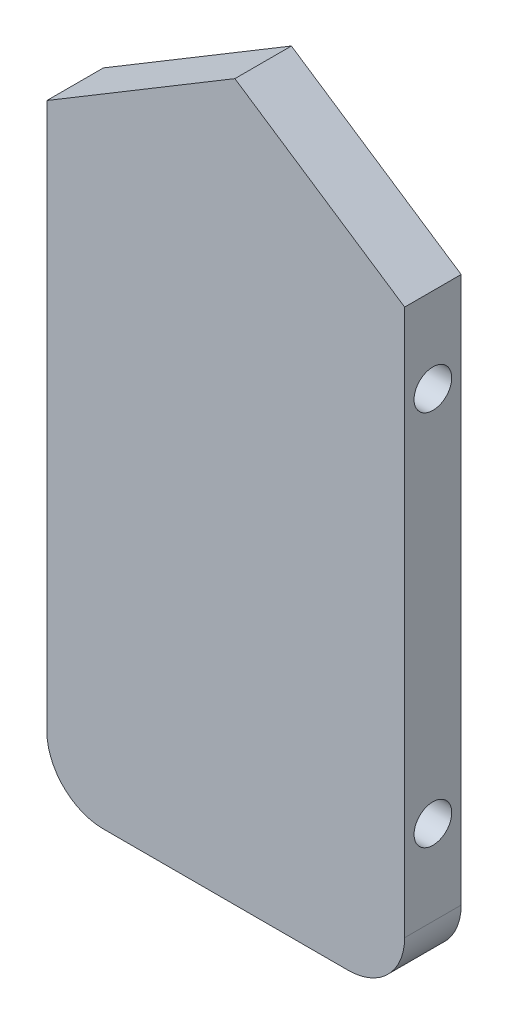
ISO-10303-21;
HEADER;
FILE_DESCRIPTION(('STEP AP214'),'2;1');
FILE_NAME('part.step','',(''),(''),'','','');
FILE_SCHEMA(('AUTOMOTIVE_DESIGN { 1 0 10303 214 1 1 1 1 }'));
ENDSEC;
DATA;
#1=APPLICATION_CONTEXT('core data for automotive mechanical design processes');
#2=APPLICATION_PROTOCOL_DEFINITION('international standard','automotive_design',2000,#1);
#3=PRODUCT_CONTEXT('',#1,'mechanical');
#4=PRODUCT('Part','Part','',(#3));
#5=PRODUCT_RELATED_PRODUCT_CATEGORY('part','',(#4));
#6=PRODUCT_DEFINITION_FORMATION('','',#4);
#7=PRODUCT_DEFINITION_CONTEXT('part definition',#1,'design');
#8=PRODUCT_DEFINITION('design','',#6,#7);
#9=PRODUCT_DEFINITION_SHAPE('','',#8);
#10=(LENGTH_UNIT() NAMED_UNIT(*) SI_UNIT(.MILLI.,.METRE.));
#11=(NAMED_UNIT(*) PLANE_ANGLE_UNIT() SI_UNIT($,.RADIAN.));
#12=(NAMED_UNIT(*) SI_UNIT($,.STERADIAN.) SOLID_ANGLE_UNIT());
#13=UNCERTAINTY_MEASURE_WITH_UNIT(LENGTH_MEASURE(1.E-05),#10,'distance_accuracy_value','');
#14=(GEOMETRIC_REPRESENTATION_CONTEXT(3) GLOBAL_UNCERTAINTY_ASSIGNED_CONTEXT((#13)) GLOBAL_UNIT_ASSIGNED_CONTEXT((#10,
#11,#12)) REPRESENTATION_CONTEXT('',''));
#15=CARTESIAN_POINT('',(0.,0.,0.));
#16=DIRECTION('',(0.,0.,1.));
#17=DIRECTION('',(1.,0.,0.));
#18=AXIS2_PLACEMENT_3D('',#15,#16,#17);
#19=CARTESIAN_POINT('',(-228.6,0.,38.1));
#20=DIRECTION('',(-1.,0.,0.));
#21=DIRECTION('',(0.,0.,1.));
#22=AXIS2_PLACEMENT_3D('',#19,#20,#21);
#23=PLANE('',#22);
#24=CARTESIAN_POINT('',(-228.6,215.9,0.));
#25=DIRECTION('',(-1.,0.,0.));
#26=DIRECTION('',(0.,0.,1.));
#27=AXIS2_PLACEMENT_3D('',#24,#25,#26);
#28=CIRCLE('',#27,25.4);
#29=CARTESIAN_POINT('',(-228.6,215.9,25.4));
#30=VERTEX_POINT('',#29);
#31=EDGE_CURVE('E202',#30,#30,#28,.T.);
#32=ORIENTED_EDGE('',*,*,#31,.F.);
#33=EDGE_LOOP('',(#32));
#34=FACE_BOUND('',#33,.T.);
#35=CARTESIAN_POINT('',(-228.6,-292.1,0.));
#36=DIRECTION('',(-1.,0.,0.));
#37=DIRECTION('',(0.,0.,1.));
#38=AXIS2_PLACEMENT_3D('',#35,#36,#37);
#39=CIRCLE('',#38,25.4);
#40=CARTESIAN_POINT('',(-228.6,-292.1,25.4000000000001));
#41=VERTEX_POINT('',#40);
#42=EDGE_CURVE('E205',#41,#41,#39,.T.);
#43=ORIENTED_EDGE('',*,*,#42,.F.);
#44=EDGE_LOOP('',(#43));
#45=FACE_BOUND('',#44,.T.);
#46=DIRECTION('',(0.,1.,0.));
#47=VECTOR('',#46,1.);
#48=CARTESIAN_POINT('',(-228.6,0.,-38.1));
#49=LINE('',#48,#47);
#50=CARTESIAN_POINT('',(-228.6,-406.4,-38.1));
#51=VERTEX_POINT('',#50);
#52=CARTESIAN_POINT('',(-228.6,330.2,-38.1));
#53=VERTEX_POINT('',#52);
#54=EDGE_CURVE('E135',#51,#53,#49,.T.);
#55=ORIENTED_EDGE('',*,*,#54,.F.);
#56=DIRECTION('',(0.,0.,-1.));
#57=VECTOR('',#56,1.);
#58=CARTESIAN_POINT('',(-228.6,-406.4,38.1));
#59=LINE('',#58,#57);
#60=CARTESIAN_POINT('',(-228.6,-406.4,38.1));
#61=VERTEX_POINT('',#60);
#62=EDGE_CURVE('E11',#61,#51,#59,.T.);
#63=ORIENTED_EDGE('',*,*,#62,.F.);
#64=DIRECTION('',(0.,1.,0.));
#65=VECTOR('',#64,1.);
#66=CARTESIAN_POINT('',(-228.6,0.,38.1));
#67=LINE('',#66,#65);
#68=CARTESIAN_POINT('',(-228.6,330.2,38.1));
#69=VERTEX_POINT('',#68);
#70=EDGE_CURVE('E159',#61,#69,#67,.T.);
#71=ORIENTED_EDGE('',*,*,#70,.T.);
#72=DIRECTION('',(0.,0.,-1.));
#73=VECTOR('',#72,1.);
#74=CARTESIAN_POINT('',(-228.6,330.2,38.1));
#75=LINE('',#74,#73);
#76=EDGE_CURVE('E58',#69,#53,#75,.T.);
#77=ORIENTED_EDGE('',*,*,#76,.T.);
#78=EDGE_LOOP('',(#55,#63,#71,#77));
#79=FACE_BOUND('',#78,.T.);
#80=ADVANCED_FACE('F41',(#34,#45,#79),#23,.T.);
#81=CARTESIAN_POINT('',(-152.4,-406.4,38.1));
#82=DIRECTION('',(0.,0.,-1.));
#83=DIRECTION('',(-1.,0.,0.));
#84=AXIS2_PLACEMENT_3D('',#81,#82,#83);
#85=CYLINDRICAL_SURFACE('',#84,76.2);
#86=CARTESIAN_POINT('',(-152.4,-406.4,-38.1));
#87=DIRECTION('',(0.,0.,1.));
#88=DIRECTION('',(1.,0.,0.));
#89=AXIS2_PLACEMENT_3D('',#86,#87,#88);
#90=CIRCLE('',#89,76.2);
#91=CARTESIAN_POINT('',(-152.4,-482.6,-38.1));
#92=VERTEX_POINT('',#91);
#93=EDGE_CURVE('E138',#92,#51,#90,.F.);
#94=ORIENTED_EDGE('',*,*,#93,.F.);
#95=DIRECTION('',(0.,0.,-1.));
#96=VECTOR('',#95,1.);
#97=CARTESIAN_POINT('',(-152.4,-482.6,38.1));
#98=LINE('',#97,#96);
#99=CARTESIAN_POINT('',(-152.4,-482.6,38.1));
#100=VERTEX_POINT('',#99);
#101=EDGE_CURVE('E50',#100,#92,#98,.T.);
#102=ORIENTED_EDGE('',*,*,#101,.F.);
#103=CARTESIAN_POINT('',(-152.4,-406.4,38.1));
#104=DIRECTION('',(0.,0.,1.));
#105=DIRECTION('',(1.,0.,0.));
#106=AXIS2_PLACEMENT_3D('',#103,#104,#105);
#107=CIRCLE('',#106,76.2);
#108=EDGE_CURVE('E183',#100,#61,#107,.F.);
#109=ORIENTED_EDGE('',*,*,#108,.T.);
#110=ORIENTED_EDGE('',*,*,#62,.T.);
#111=EDGE_LOOP('',(#94,#102,#109,#110));
#112=FACE_BOUND('',#111,.T.);
#113=ADVANCED_FACE('F182',(#112),#85,.T.);
#114=CARTESIAN_POINT('',(0.,-482.6,38.1));
#115=DIRECTION('',(0.,1.,0.));
#116=DIRECTION('',(0.,0.,1.));
#117=AXIS2_PLACEMENT_3D('',#114,#115,#116);
#118=PLANE('',#117);
#119=DIRECTION('',(1.,0.,0.));
#120=VECTOR('',#119,1.);
#121=CARTESIAN_POINT('',(0.,-482.6,-38.1));
#122=LINE('',#121,#120);
#123=CARTESIAN_POINT('',(177.799999999999,-482.6,-38.1));
#124=VERTEX_POINT('',#123);
#125=EDGE_CURVE('E143',#92,#124,#122,.T.);
#126=ORIENTED_EDGE('',*,*,#125,.T.);
#127=DIRECTION('',(0.,0.,-1.));
#128=VECTOR('',#127,1.);
#129=CARTESIAN_POINT('',(177.799999999999,-482.6,38.1));
#130=LINE('',#129,#128);
#131=CARTESIAN_POINT('',(177.799999999999,-482.6,38.1));
#132=VERTEX_POINT('',#131);
#133=EDGE_CURVE('E166',#132,#124,#130,.T.);
#134=ORIENTED_EDGE('',*,*,#133,.F.);
#135=DIRECTION('',(1.,0.,0.));
#136=VECTOR('',#135,1.);
#137=CARTESIAN_POINT('',(0.,-482.6,38.1));
#138=LINE('',#137,#136);
#139=EDGE_CURVE('E129',#100,#132,#138,.T.);
#140=ORIENTED_EDGE('',*,*,#139,.F.);
#141=ORIENTED_EDGE('',*,*,#101,.T.);
#142=EDGE_LOOP('',(#126,#134,#140,#141));
#143=FACE_BOUND('',#142,.T.);
#144=ADVANCED_FACE('F173',(#143),#118,.F.);
#145=CARTESIAN_POINT('',(177.8,-406.4,38.1));
#146=DIRECTION('',(0.,0.,-1.));
#147=DIRECTION('',(-1.,0.,0.));
#148=AXIS2_PLACEMENT_3D('',#145,#146,#147);
#149=CYLINDRICAL_SURFACE('',#148,76.2);
#150=CARTESIAN_POINT('',(177.8,-406.4,-38.1));
#151=DIRECTION('',(0.,0.,1.));
#152=DIRECTION('',(1.,0.,0.));
#153=AXIS2_PLACEMENT_3D('',#150,#151,#152);
#154=CIRCLE('',#153,76.2);
#155=CARTESIAN_POINT('',(254.,-406.399999999999,-38.1));
#156=VERTEX_POINT('',#155);
#157=EDGE_CURVE('E146',#124,#156,#154,.T.);
#158=ORIENTED_EDGE('',*,*,#157,.T.);
#159=DIRECTION('',(0.,0.,-1.));
#160=VECTOR('',#159,1.);
#161=CARTESIAN_POINT('',(254.,-406.399999999999,38.1));
#162=LINE('',#161,#160);
#163=CARTESIAN_POINT('',(254.,-406.399999999999,38.1));
#164=VERTEX_POINT('',#163);
#165=EDGE_CURVE('E113',#164,#156,#162,.T.);
#166=ORIENTED_EDGE('',*,*,#165,.F.);
#167=CARTESIAN_POINT('',(177.8,-406.4,38.1));
#168=DIRECTION('',(0.,0.,1.));
#169=DIRECTION('',(1.,0.,0.));
#170=AXIS2_PLACEMENT_3D('',#167,#168,#169);
#171=CIRCLE('',#170,76.2);
#172=EDGE_CURVE('E124',#132,#164,#171,.T.);
#173=ORIENTED_EDGE('',*,*,#172,.F.);
#174=ORIENTED_EDGE('',*,*,#133,.T.);
#175=EDGE_LOOP('',(#158,#166,#173,#174));
#176=FACE_BOUND('',#175,.T.);
#177=ADVANCED_FACE('F220',(#176),#149,.T.);
#178=CARTESIAN_POINT('',(254.,0.,38.1));
#179=DIRECTION('',(1.,0.,0.));
#180=DIRECTION('',(0.,0.,-1.));
#181=AXIS2_PLACEMENT_3D('',#178,#179,#180);
#182=PLANE('',#181);
#183=CARTESIAN_POINT('',(254.,215.9,0.));
#184=DIRECTION('',(-1.,0.,0.));
#185=DIRECTION('',(0.,0.,1.));
#186=AXIS2_PLACEMENT_3D('',#183,#184,#185);
#187=CIRCLE('',#186,25.4);
#188=CARTESIAN_POINT('',(254.,215.9,25.4));
#189=VERTEX_POINT('',#188);
#190=EDGE_CURVE('E139',#189,#189,#187,.T.);
#191=ORIENTED_EDGE('',*,*,#190,.T.);
#192=EDGE_LOOP('',(#191));
#193=FACE_BOUND('',#192,.T.);
#194=CARTESIAN_POINT('',(254.,-292.1,0.));
#195=DIRECTION('',(-1.,0.,0.));
#196=DIRECTION('',(0.,0.,1.));
#197=AXIS2_PLACEMENT_3D('',#194,#195,#196);
#198=CIRCLE('',#197,25.4);
#199=CARTESIAN_POINT('',(254.,-292.1,25.4000000000001));
#200=VERTEX_POINT('',#199);
#201=EDGE_CURVE('E208',#200,#200,#198,.T.);
#202=ORIENTED_EDGE('',*,*,#201,.T.);
#203=EDGE_LOOP('',(#202));
#204=FACE_BOUND('',#203,.T.);
#205=DIRECTION('',(0.,-1.,0.));
#206=VECTOR('',#205,1.);
#207=CARTESIAN_POINT('',(254.,0.,-38.1));
#208=LINE('',#207,#206);
#209=CARTESIAN_POINT('',(254.,330.2,-38.1));
#210=VERTEX_POINT('',#209);
#211=EDGE_CURVE('E109',#210,#156,#208,.T.);
#212=ORIENTED_EDGE('',*,*,#211,.F.);
#213=DIRECTION('',(0.,0.,-1.));
#214=VECTOR('',#213,1.);
#215=CARTESIAN_POINT('',(254.,330.2,38.1));
#216=LINE('',#215,#214);
#217=CARTESIAN_POINT('',(254.,330.2,38.1));
#218=VERTEX_POINT('',#217);
#219=EDGE_CURVE('E103',#218,#210,#216,.T.);
#220=ORIENTED_EDGE('',*,*,#219,.F.);
#221=DIRECTION('',(0.,-1.,0.));
#222=VECTOR('',#221,1.);
#223=CARTESIAN_POINT('',(254.,0.,38.1));
#224=LINE('',#223,#222);
#225=EDGE_CURVE('E107',#218,#164,#224,.T.);
#226=ORIENTED_EDGE('',*,*,#225,.T.);
#227=ORIENTED_EDGE('',*,*,#165,.T.);
#228=EDGE_LOOP('',(#212,#220,#226,#227));
#229=FACE_BOUND('',#228,.T.);
#230=ADVANCED_FACE('F105',(#193,#204,#229),#182,.T.);
#231=CARTESIAN_POINT('',(230.28852690734,345.98253152063,38.1));
#232=DIRECTION('',(-0.554089563573565,-0.832457059276247,0.));
#233=DIRECTION('',(0.832457059276247,-0.554089563573565,0.));
#234=AXIS2_PLACEMENT_3D('',#231,#232,#233);
#235=PLANE('',#234);
#236=DIRECTION('',(-0.832457059276247,0.554089563573565,0.));
#237=VECTOR('',#236,1.);
#238=CARTESIAN_POINT('',(230.28852690734,345.98253152063,-38.1));
#239=LINE('',#238,#237);
#240=CARTESIAN_POINT('',(25.0361931102202,482.6,-38.1));
#241=VERTEX_POINT('',#240);
#242=EDGE_CURVE('E152',#210,#241,#239,.T.);
#243=ORIENTED_EDGE('',*,*,#242,.T.);
#244=DIRECTION('',(0.,0.,-1.));
#245=VECTOR('',#244,1.);
#246=CARTESIAN_POINT('',(25.0361931102202,482.6,38.1));
#247=LINE('',#246,#245);
#248=CARTESIAN_POINT('',(25.0361931102202,482.6,38.1));
#249=VERTEX_POINT('',#248);
#250=EDGE_CURVE('E81',#249,#241,#247,.T.);
#251=ORIENTED_EDGE('',*,*,#250,.F.);
#252=DIRECTION('',(-0.832457059276247,0.554089563573565,0.));
#253=VECTOR('',#252,1.);
#254=CARTESIAN_POINT('',(230.28852690734,345.98253152063,38.1));
#255=LINE('',#254,#253);
#256=EDGE_CURVE('E115',#218,#249,#255,.T.);
#257=ORIENTED_EDGE('',*,*,#256,.F.);
#258=ORIENTED_EDGE('',*,*,#219,.T.);
#259=EDGE_LOOP('',(#243,#251,#257,#258));
#260=FACE_BOUND('',#259,.T.);
#261=ADVANCED_FACE('F116',(#260),#235,.F.);
#262=CARTESIAN_POINT('',(-206.414047954581,343.530664879726,38.1));
#263=DIRECTION('',(-0.515038074910052,0.857167300702113,0.));
#264=DIRECTION('',(-0.857167300702113,-0.515038074910052,0.));
#265=AXIS2_PLACEMENT_3D('',#262,#263,#264);
#266=PLANE('',#265);
#267=DIRECTION('',(0.857167300702113,0.515038074910052,0.));
#268=VECTOR('',#267,1.);
#269=CARTESIAN_POINT('',(-206.414047954581,343.530664879726,-38.1));
#270=LINE('',#269,#268);
#271=EDGE_CURVE('E155',#53,#241,#270,.T.);
#272=ORIENTED_EDGE('',*,*,#271,.F.);
#273=ORIENTED_EDGE('',*,*,#76,.F.);
#274=DIRECTION('',(0.857167300702113,0.515038074910052,0.));
#275=VECTOR('',#274,1.);
#276=CARTESIAN_POINT('',(-206.414047954581,343.530664879726,38.1));
#277=LINE('',#276,#275);
#278=EDGE_CURVE('E120',#69,#249,#277,.T.);
#279=ORIENTED_EDGE('',*,*,#278,.T.);
#280=ORIENTED_EDGE('',*,*,#250,.T.);
#281=EDGE_LOOP('',(#272,#273,#279,#280));
#282=FACE_BOUND('',#281,.T.);
#283=ADVANCED_FACE('F184',(#282),#266,.T.);
#284=CARTESIAN_POINT('',(0.,0.,38.1));
#285=DIRECTION('',(0.,0.,1.));
#286=DIRECTION('',(1.,0.,0.));
#287=AXIS2_PLACEMENT_3D('',#284,#285,#286);
#288=PLANE('',#287);
#289=ORIENTED_EDGE('',*,*,#70,.F.);
#290=ORIENTED_EDGE('',*,*,#108,.F.);
#291=ORIENTED_EDGE('',*,*,#139,.T.);
#292=ORIENTED_EDGE('',*,*,#172,.T.);
#293=ORIENTED_EDGE('',*,*,#225,.F.);
#294=ORIENTED_EDGE('',*,*,#256,.T.);
#295=ORIENTED_EDGE('',*,*,#278,.F.);
#296=EDGE_LOOP('',(#289,#290,#291,#292,#293,#294,#295));
#297=FACE_BOUND('',#296,.T.);
#298=ADVANCED_FACE('F122',(#297),#288,.T.);
#299=CARTESIAN_POINT('',(0.,0.,-38.1));
#300=DIRECTION('',(0.,0.,1.));
#301=DIRECTION('',(1.,0.,0.));
#302=AXIS2_PLACEMENT_3D('',#299,#300,#301);
#303=PLANE('',#302);
#304=ORIENTED_EDGE('',*,*,#54,.T.);
#305=ORIENTED_EDGE('',*,*,#271,.T.);
#306=ORIENTED_EDGE('',*,*,#242,.F.);
#307=ORIENTED_EDGE('',*,*,#211,.T.);
#308=ORIENTED_EDGE('',*,*,#157,.F.);
#309=ORIENTED_EDGE('',*,*,#125,.F.);
#310=ORIENTED_EDGE('',*,*,#93,.T.);
#311=EDGE_LOOP('',(#304,#305,#306,#307,#308,#309,#310));
#312=FACE_BOUND('',#311,.T.);
#313=ADVANCED_FACE('F181',(#312),#303,.F.);
#314=CARTESIAN_POINT('',(254.,-292.1,0.));
#315=DIRECTION('',(-1.,0.,0.));
#316=DIRECTION('',(0.,0.,1.));
#317=AXIS2_PLACEMENT_3D('',#314,#315,#316);
#318=CYLINDRICAL_SURFACE('',#317,25.4);
#319=CARTESIAN_POINT('',(254.,-292.1,25.4000000000001));
#320=CARTESIAN_POINT('',(248.972916666667,-292.1,25.4000000000001));
#321=CARTESIAN_POINT('',(243.945833333333,-292.1,25.4000000000001));
#322=CARTESIAN_POINT('',(233.891666666667,-292.1,25.4000000000001));
#323=CARTESIAN_POINT('',(228.864583333333,-292.1,25.4000000000001));
#324=CARTESIAN_POINT('',(218.810416666667,-292.1,25.4000000000001));
#325=CARTESIAN_POINT('',(213.783333333333,-292.1,25.4000000000001));
#326=CARTESIAN_POINT('',(203.729166666667,-292.1,25.4000000000001));
#327=CARTESIAN_POINT('',(198.702083333333,-292.1,25.4000000000001));
#328=CARTESIAN_POINT('',(188.647916666667,-292.1,25.4000000000001));
#329=CARTESIAN_POINT('',(183.620833333333,-292.1,25.4000000000001));
#330=CARTESIAN_POINT('',(173.566666666667,-292.1,25.4000000000001));
#331=CARTESIAN_POINT('',(168.539583333333,-292.1,25.4000000000001));
#332=CARTESIAN_POINT('',(158.485416666667,-292.1,25.4000000000001));
#333=CARTESIAN_POINT('',(153.458333333333,-292.1,25.4000000000001));
#334=CARTESIAN_POINT('',(143.404166666667,-292.1,25.4000000000001));
#335=CARTESIAN_POINT('',(138.377083333333,-292.1,25.4000000000001));
#336=CARTESIAN_POINT('',(128.322916666667,-292.1,25.4000000000001));
#337=CARTESIAN_POINT('',(123.295833333333,-292.1,25.4000000000001));
#338=CARTESIAN_POINT('',(113.241666666667,-292.1,25.4000000000001));
#339=CARTESIAN_POINT('',(108.214583333333,-292.1,25.4000000000001));
#340=CARTESIAN_POINT('',(98.1604166666667,-292.1,25.4000000000001));
#341=CARTESIAN_POINT('',(93.1333333333334,-292.1,25.4000000000001));
#342=CARTESIAN_POINT('',(83.0791666666667,-292.1,25.4000000000001));
#343=CARTESIAN_POINT('',(78.0520833333334,-292.1,25.4000000000001));
#344=CARTESIAN_POINT('',(67.9979166666667,-292.1,25.4000000000001));
#345=CARTESIAN_POINT('',(62.9708333333334,-292.1,25.4000000000001));
#346=CARTESIAN_POINT('',(52.9166666666667,-292.1,25.4000000000001));
#347=CARTESIAN_POINT('',(47.8895833333334,-292.1,25.4000000000001));
#348=CARTESIAN_POINT('',(37.8354166666667,-292.1,25.4000000000001));
#349=CARTESIAN_POINT('',(32.8083333333334,-292.1,25.4000000000001));
#350=CARTESIAN_POINT('',(22.7541666666667,-292.1,25.4000000000001));
#351=CARTESIAN_POINT('',(17.7270833333333,-292.1,25.4000000000001));
#352=CARTESIAN_POINT('',(7.6729166666667,-292.1,25.4000000000001));
#353=CARTESIAN_POINT('',(2.64583333333337,-292.1,25.4000000000001));
#354=CARTESIAN_POINT('',(-7.40833333333328,-292.1,25.4000000000001));
#355=CARTESIAN_POINT('',(-12.4354166666666,-292.1,25.4000000000001));
#356=CARTESIAN_POINT('',(-22.4895833333333,-292.1,25.4000000000001));
#357=CARTESIAN_POINT('',(-27.5166666666666,-292.1,25.4000000000001));
#358=CARTESIAN_POINT('',(-37.5708333333333,-292.1,25.4000000000001));
#359=CARTESIAN_POINT('',(-42.5979166666666,-292.1,25.4000000000001));
#360=CARTESIAN_POINT('',(-52.6520833333333,-292.1,25.4000000000001));
#361=CARTESIAN_POINT('',(-57.6791666666666,-292.1,25.4000000000001));
#362=CARTESIAN_POINT('',(-67.7333333333333,-292.1,25.4000000000001));
#363=CARTESIAN_POINT('',(-72.7604166666666,-292.1,25.4000000000001));
#364=CARTESIAN_POINT('',(-82.8145833333333,-292.1,25.4000000000001));
#365=CARTESIAN_POINT('',(-87.8416666666666,-292.1,25.4000000000001));
#366=CARTESIAN_POINT('',(-97.8958333333333,-292.1,25.4000000000001));
#367=CARTESIAN_POINT('',(-102.922916666667,-292.1,25.4000000000001));
#368=CARTESIAN_POINT('',(-112.977083333333,-292.1,25.4000000000001));
#369=CARTESIAN_POINT('',(-118.004166666667,-292.1,25.4000000000001));
#370=CARTESIAN_POINT('',(-128.058333333333,-292.1,25.4000000000001));
#371=CARTESIAN_POINT('',(-133.085416666667,-292.1,25.4000000000001));
#372=CARTESIAN_POINT('',(-143.139583333333,-292.1,25.4000000000001));
#373=CARTESIAN_POINT('',(-148.166666666667,-292.1,25.4000000000001));
#374=CARTESIAN_POINT('',(-158.220833333333,-292.1,25.4000000000001));
#375=CARTESIAN_POINT('',(-163.247916666667,-292.1,25.4000000000001));
#376=CARTESIAN_POINT('',(-173.302083333333,-292.1,25.4000000000001));
#377=CARTESIAN_POINT('',(-178.329166666667,-292.1,25.4000000000001));
#378=CARTESIAN_POINT('',(-188.383333333333,-292.1,25.4000000000001));
#379=CARTESIAN_POINT('',(-193.410416666667,-292.1,25.4000000000001));
#380=CARTESIAN_POINT('',(-203.464583333333,-292.1,25.4000000000001));
#381=CARTESIAN_POINT('',(-208.491666666667,-292.1,25.4000000000001));
#382=CARTESIAN_POINT('',(-218.545833333333,-292.1,25.4000000000001));
#383=CARTESIAN_POINT('',(-223.572916666667,-292.1,25.4000000000001));
#384=CARTESIAN_POINT('',(-228.6,-292.1,25.4000000000001));
#385=B_SPLINE_CURVE_WITH_KNOTS('',3,(#319,#320,#321,#322,#323,#324,#325,#326,#327,#328,#329,
#330,#331,#332,#333,#334,#335,#336,#337,#338,#339,#340,#341,#342,#343,#344,#345,#346,#347,#348,
#349,#350,#351,#352,#353,#354,#355,#356,#357,#358,#359,#360,#361,#362,#363,#364,#365,#366,#367,
#368,#369,#370,#371,#372,#373,#374,#375,#376,#377,#378,#379,#380,#381,#382,#383,#384),
.UNSPECIFIED.,.F.,.F.,(4,2,2,2,2,2,2,2,2,2,2,2,2,2,2,2,2,2,2,2,2,2,2,2,2,2,2,2,2,2,2,2,4),(0.,
15.08125,30.1625,45.24375,60.325,75.40625,90.4875,105.56875,120.65,135.73125,150.8125,165.89375,
180.975,196.05625,211.1375,226.21875,241.3,256.38125,271.4625,286.54375,301.625,316.70625,
331.7875,346.86875,361.95,377.03125,392.1125,407.19375,422.275,437.35625,452.4375,467.51875,
482.6),.UNSPECIFIED.);
#386=EDGE_CURVE('BSEAM278',#200,#41,#385,.T.);
#387=ORIENTED_EDGE('',*,*,#201,.F.);
#388=ORIENTED_EDGE('',*,*,#42,.T.);
#389=ORIENTED_EDGE('',*,*,#386,.T.);
#390=ORIENTED_EDGE('',*,*,#386,.F.);
#391=EDGE_LOOP('',(#387,#389,#388,#390));
#392=FACE_BOUND('',#391,.T.);
#393=ADVANCED_FACE('F278',(#392),#318,.F.);
#394=CARTESIAN_POINT('',(254.,215.9,0.));
#395=DIRECTION('',(-1.,0.,0.));
#396=DIRECTION('',(0.,0.,1.));
#397=AXIS2_PLACEMENT_3D('',#394,#395,#396);
#398=CYLINDRICAL_SURFACE('',#397,25.4);
#399=CARTESIAN_POINT('',(254.,215.9,25.4));
#400=CARTESIAN_POINT('',(248.972916666667,215.9,25.4));
#401=CARTESIAN_POINT('',(243.945833333333,215.9,25.4));
#402=CARTESIAN_POINT('',(233.891666666667,215.9,25.4));
#403=CARTESIAN_POINT('',(228.864583333333,215.9,25.4));
#404=CARTESIAN_POINT('',(218.810416666667,215.9,25.4));
#405=CARTESIAN_POINT('',(213.783333333333,215.9,25.4));
#406=CARTESIAN_POINT('',(203.729166666667,215.9,25.4));
#407=CARTESIAN_POINT('',(198.702083333333,215.9,25.4));
#408=CARTESIAN_POINT('',(188.647916666667,215.9,25.4));
#409=CARTESIAN_POINT('',(183.620833333333,215.9,25.4));
#410=CARTESIAN_POINT('',(173.566666666667,215.9,25.4));
#411=CARTESIAN_POINT('',(168.539583333333,215.9,25.4));
#412=CARTESIAN_POINT('',(158.485416666667,215.9,25.4));
#413=CARTESIAN_POINT('',(153.458333333333,215.9,25.4));
#414=CARTESIAN_POINT('',(143.404166666667,215.9,25.4));
#415=CARTESIAN_POINT('',(138.377083333333,215.9,25.4));
#416=CARTESIAN_POINT('',(128.322916666667,215.9,25.4));
#417=CARTESIAN_POINT('',(123.295833333333,215.9,25.4));
#418=CARTESIAN_POINT('',(113.241666666667,215.9,25.4));
#419=CARTESIAN_POINT('',(108.214583333333,215.9,25.4));
#420=CARTESIAN_POINT('',(98.1604166666667,215.9,25.4));
#421=CARTESIAN_POINT('',(93.1333333333334,215.9,25.4));
#422=CARTESIAN_POINT('',(83.0791666666667,215.9,25.4));
#423=CARTESIAN_POINT('',(78.0520833333334,215.9,25.4));
#424=CARTESIAN_POINT('',(67.9979166666667,215.9,25.4));
#425=CARTESIAN_POINT('',(62.9708333333334,215.9,25.4));
#426=CARTESIAN_POINT('',(52.9166666666667,215.9,25.4));
#427=CARTESIAN_POINT('',(47.8895833333334,215.9,25.4));
#428=CARTESIAN_POINT('',(37.8354166666667,215.9,25.4));
#429=CARTESIAN_POINT('',(32.8083333333334,215.9,25.4));
#430=CARTESIAN_POINT('',(22.7541666666667,215.9,25.4));
#431=CARTESIAN_POINT('',(17.7270833333333,215.9,25.4));
#432=CARTESIAN_POINT('',(7.6729166666667,215.9,25.4));
#433=CARTESIAN_POINT('',(2.64583333333337,215.9,25.4));
#434=CARTESIAN_POINT('',(-7.40833333333328,215.9,25.4));
#435=CARTESIAN_POINT('',(-12.4354166666666,215.9,25.4));
#436=CARTESIAN_POINT('',(-22.4895833333333,215.9,25.4));
#437=CARTESIAN_POINT('',(-27.5166666666666,215.9,25.4));
#438=CARTESIAN_POINT('',(-37.5708333333333,215.9,25.4));
#439=CARTESIAN_POINT('',(-42.5979166666666,215.9,25.4));
#440=CARTESIAN_POINT('',(-52.6520833333333,215.9,25.4));
#441=CARTESIAN_POINT('',(-57.6791666666666,215.9,25.4));
#442=CARTESIAN_POINT('',(-67.7333333333333,215.9,25.4));
#443=CARTESIAN_POINT('',(-72.7604166666666,215.9,25.4));
#444=CARTESIAN_POINT('',(-82.8145833333333,215.9,25.4));
#445=CARTESIAN_POINT('',(-87.8416666666666,215.9,25.4));
#446=CARTESIAN_POINT('',(-97.8958333333333,215.9,25.4));
#447=CARTESIAN_POINT('',(-102.922916666667,215.9,25.4));
#448=CARTESIAN_POINT('',(-112.977083333333,215.9,25.4));
#449=CARTESIAN_POINT('',(-118.004166666667,215.9,25.4));
#450=CARTESIAN_POINT('',(-128.058333333333,215.9,25.4));
#451=CARTESIAN_POINT('',(-133.085416666667,215.9,25.4));
#452=CARTESIAN_POINT('',(-143.139583333333,215.9,25.4));
#453=CARTESIAN_POINT('',(-148.166666666667,215.9,25.4));
#454=CARTESIAN_POINT('',(-158.220833333333,215.9,25.4));
#455=CARTESIAN_POINT('',(-163.247916666667,215.9,25.4));
#456=CARTESIAN_POINT('',(-173.302083333333,215.9,25.4));
#457=CARTESIAN_POINT('',(-178.329166666667,215.9,25.4));
#458=CARTESIAN_POINT('',(-188.383333333333,215.9,25.4));
#459=CARTESIAN_POINT('',(-193.410416666667,215.9,25.4));
#460=CARTESIAN_POINT('',(-203.464583333333,215.9,25.4));
#461=CARTESIAN_POINT('',(-208.491666666667,215.9,25.4));
#462=CARTESIAN_POINT('',(-218.545833333333,215.9,25.4));
#463=CARTESIAN_POINT('',(-223.572916666667,215.9,25.4));
#464=CARTESIAN_POINT('',(-228.6,215.9,25.4));
#465=B_SPLINE_CURVE_WITH_KNOTS('',3,(#399,#400,#401,#402,#403,#404,#405,#406,#407,#408,#409,
#410,#411,#412,#413,#414,#415,#416,#417,#418,#419,#420,#421,#422,#423,#424,#425,#426,#427,#428,
#429,#430,#431,#432,#433,#434,#435,#436,#437,#438,#439,#440,#441,#442,#443,#444,#445,#446,#447,
#448,#449,#450,#451,#452,#453,#454,#455,#456,#457,#458,#459,#460,#461,#462,#463,#464),
.UNSPECIFIED.,.F.,.F.,(4,2,2,2,2,2,2,2,2,2,2,2,2,2,2,2,2,2,2,2,2,2,2,2,2,2,2,2,2,2,2,2,4),(0.,
15.08125,30.1625,45.24375,60.325,75.40625,90.4875,105.56875,120.65,135.73125,150.8125,165.89375,
180.975,196.05625,211.1375,226.21875,241.3,256.38125,271.4625,286.54375,301.625,316.70625,
331.7875,346.86875,361.95,377.03125,392.1125,407.19375,422.275,437.35625,452.4375,467.51875,
482.6),.UNSPECIFIED.);
#466=EDGE_CURVE('BSEAM287',#189,#30,#465,.T.);
#467=ORIENTED_EDGE('',*,*,#190,.F.);
#468=ORIENTED_EDGE('',*,*,#31,.T.);
#469=ORIENTED_EDGE('',*,*,#466,.T.);
#470=ORIENTED_EDGE('',*,*,#466,.F.);
#471=EDGE_LOOP('',(#467,#469,#468,#470));
#472=FACE_BOUND('',#471,.T.);
#473=ADVANCED_FACE('F287',(#472),#398,.F.);
#474=CLOSED_SHELL('',(#80,#113,#144,#177,#230,#261,#283,#298,#313,#393,#473));
#475=MANIFOLD_SOLID_BREP('B2',#474);
#476=ADVANCED_BREP_SHAPE_REPRESENTATION('',(#18,#475),#14);
#477=SHAPE_DEFINITION_REPRESENTATION(#9,#476);
ENDSEC;
END-ISO-10303-21;
